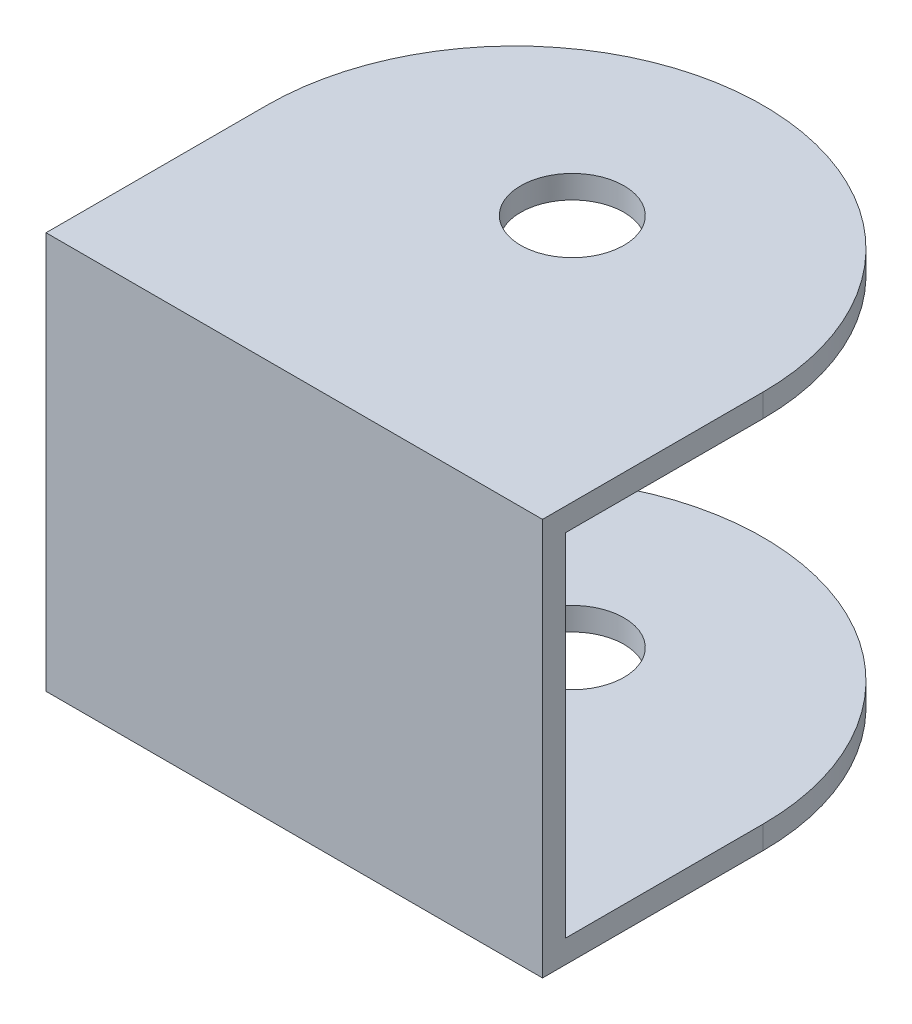
ISO-10303-21;
HEADER;
FILE_DESCRIPTION(('STEP AP214'),'2;1');
FILE_NAME('part.step','',(''),(''),'','','');
FILE_SCHEMA(('AUTOMOTIVE_DESIGN { 1 0 10303 214 1 1 1 1 }'));
ENDSEC;
DATA;
#1=APPLICATION_CONTEXT('core data for automotive mechanical design processes');
#2=APPLICATION_PROTOCOL_DEFINITION('international standard','automotive_design',2000,#1);
#3=PRODUCT_CONTEXT('',#1,'mechanical');
#4=PRODUCT('Part','Part','',(#3));
#5=PRODUCT_RELATED_PRODUCT_CATEGORY('part','',(#4));
#6=PRODUCT_DEFINITION_FORMATION('','',#4);
#7=PRODUCT_DEFINITION_CONTEXT('part definition',#1,'design');
#8=PRODUCT_DEFINITION('design','',#6,#7);
#9=PRODUCT_DEFINITION_SHAPE('','',#8);
#10=(LENGTH_UNIT() NAMED_UNIT(*) SI_UNIT(.MILLI.,.METRE.));
#11=(NAMED_UNIT(*) PLANE_ANGLE_UNIT() SI_UNIT($,.RADIAN.));
#12=(NAMED_UNIT(*) SI_UNIT($,.STERADIAN.) SOLID_ANGLE_UNIT());
#13=UNCERTAINTY_MEASURE_WITH_UNIT(LENGTH_MEASURE(1.E-05),#10,'distance_accuracy_value','');
#14=(GEOMETRIC_REPRESENTATION_CONTEXT(3) GLOBAL_UNCERTAINTY_ASSIGNED_CONTEXT((#13)) GLOBAL_UNIT_ASSIGNED_CONTEXT((#10,
#11,#12)) REPRESENTATION_CONTEXT('',''));
#15=CARTESIAN_POINT('',(0.,0.,0.));
#16=DIRECTION('',(0.,0.,1.));
#17=DIRECTION('',(1.,0.,0.));
#18=AXIS2_PLACEMENT_3D('',#15,#16,#17);
#19=CARTESIAN_POINT('',(0.,25.4,-14.1111111111111));
#20=DIRECTION('',(0.,-1.,0.));
#21=DIRECTION('',(0.,0.,-1.));
#22=AXIS2_PLACEMENT_3D('',#19,#20,#21);
#23=CYLINDRICAL_SURFACE('',#22,15.875);
#24=DIRECTION('',(0.,-1.,0.));
#25=VECTOR('',#24,1.);
#26=CARTESIAN_POINT('',(15.875,25.4,-14.1111111111111));
#27=LINE('',#26,#25);
#28=CARTESIAN_POINT('',(15.875,25.4,-14.1111111111111));
#29=VERTEX_POINT('',#28);
#30=CARTESIAN_POINT('',(15.875,23.9268,-14.1111111111111));
#31=VERTEX_POINT('',#30);
#32=EDGE_CURVE('E163',#29,#31,#27,.T.);
#33=ORIENTED_EDGE('',*,*,#32,.T.);
#34=CARTESIAN_POINT('',(0.,23.9268,-14.1111111111111));
#35=DIRECTION('',(0.,1.,0.));
#36=DIRECTION('',(0.,0.,1.));
#37=AXIS2_PLACEMENT_3D('',#34,#35,#36);
#38=CIRCLE('',#37,15.875);
#39=CARTESIAN_POINT('',(-15.875,23.9268,-14.1111111111111));
#40=VERTEX_POINT('',#39);
#41=EDGE_CURVE('E138',#31,#40,#38,.T.);
#42=ORIENTED_EDGE('',*,*,#41,.T.);
#43=DIRECTION('',(0.,-1.,0.));
#44=VECTOR('',#43,1.);
#45=CARTESIAN_POINT('',(-15.875,25.4,-14.1111111111111));
#46=LINE('',#45,#44);
#47=CARTESIAN_POINT('',(-15.875,25.4,-14.1111111111111));
#48=VERTEX_POINT('',#47);
#49=EDGE_CURVE('E160',#48,#40,#46,.T.);
#50=ORIENTED_EDGE('',*,*,#49,.F.);
#51=CARTESIAN_POINT('',(0.,25.4,-14.1111111111111));
#52=DIRECTION('',(0.,1.,0.));
#53=DIRECTION('',(0.,0.,-1.));
#54=AXIS2_PLACEMENT_3D('',#51,#52,#53);
#55=CIRCLE('',#54,15.875);
#56=EDGE_CURVE('E145',#29,#48,#55,.T.);
#57=ORIENTED_EDGE('',*,*,#56,.F.);
#58=EDGE_LOOP('',(#33,#42,#50,#57));
#59=FACE_BOUND('',#58,.T.);
#60=ADVANCED_FACE('F34',(#59),#23,.T.);
#61=CARTESIAN_POINT('',(0.,25.4,0.));
#62=DIRECTION('',(0.,0.,-1.));
#63=DIRECTION('',(-1.,0.,0.));
#64=AXIS2_PLACEMENT_3D('',#61,#62,#63);
#65=PLANE('',#64);
#66=DIRECTION('',(1.,0.,0.));
#67=VECTOR('',#66,1.);
#68=CARTESIAN_POINT('',(0.,0.,0.));
#69=LINE('',#68,#67);
#70=CARTESIAN_POINT('',(-15.875,0.,0.));
#71=VERTEX_POINT('',#70);
#72=CARTESIAN_POINT('',(15.875,0.,0.));
#73=VERTEX_POINT('',#72);
#74=EDGE_CURVE('E80',#71,#73,#69,.T.);
#75=ORIENTED_EDGE('',*,*,#74,.T.);
#76=DIRECTION('',(0.,-1.,0.));
#77=VECTOR('',#76,1.);
#78=CARTESIAN_POINT('',(15.875,25.4,0.));
#79=LINE('',#78,#77);
#80=CARTESIAN_POINT('',(15.875,25.4,0.));
#81=VERTEX_POINT('',#80);
#82=EDGE_CURVE('E43',#81,#73,#79,.T.);
#83=ORIENTED_EDGE('',*,*,#82,.F.);
#84=DIRECTION('',(1.,0.,0.));
#85=VECTOR('',#84,1.);
#86=CARTESIAN_POINT('',(-15.875,25.4,0.));
#87=LINE('',#86,#85);
#88=CARTESIAN_POINT('',(-15.875,25.4,0.));
#89=VERTEX_POINT('',#88);
#90=EDGE_CURVE('E85',#89,#81,#87,.T.);
#91=ORIENTED_EDGE('',*,*,#90,.F.);
#92=DIRECTION('',(0.,-1.,0.));
#93=VECTOR('',#92,1.);
#94=CARTESIAN_POINT('',(-15.875,25.4,0.));
#95=LINE('',#94,#93);
#96=EDGE_CURVE('E148',#89,#71,#95,.T.);
#97=ORIENTED_EDGE('',*,*,#96,.T.);
#98=EDGE_LOOP('',(#75,#83,#91,#97));
#99=FACE_BOUND('',#98,.T.);
#100=ADVANCED_FACE('F36',(#99),#65,.F.);
#101=CARTESIAN_POINT('',(15.875,25.4,-14.1111111111111));
#102=DIRECTION('',(-1.,0.,0.));
#103=DIRECTION('',(0.,0.,1.));
#104=AXIS2_PLACEMENT_3D('',#101,#102,#103);
#105=PLANE('',#104);
#106=DIRECTION('',(0.,-1.,0.));
#107=VECTOR('',#106,1.);
#108=CARTESIAN_POINT('',(15.875,1.4732,-1.4732));
#109=LINE('',#108,#107);
#110=CARTESIAN_POINT('',(15.875,23.9268,-1.4732));
#111=VERTEX_POINT('',#110);
#112=CARTESIAN_POINT('',(15.875,1.4732,-1.4732));
#113=VERTEX_POINT('',#112);
#114=EDGE_CURVE('E115',#111,#113,#109,.T.);
#115=ORIENTED_EDGE('',*,*,#114,.F.);
#116=DIRECTION('',(0.,0.,1.));
#117=VECTOR('',#116,1.);
#118=CARTESIAN_POINT('',(15.875,23.9268,-1.4732));
#119=LINE('',#118,#117);
#120=EDGE_CURVE('E126',#31,#111,#119,.T.);
#121=ORIENTED_EDGE('',*,*,#120,.F.);
#122=ORIENTED_EDGE('',*,*,#32,.F.);
#123=DIRECTION('',(0.,0.,-1.));
#124=VECTOR('',#123,1.);
#125=CARTESIAN_POINT('',(15.875,25.4,-14.1111111111111));
#126=LINE('',#125,#124);
#127=EDGE_CURVE('E142',#81,#29,#126,.T.);
#128=ORIENTED_EDGE('',*,*,#127,.F.);
#129=ORIENTED_EDGE('',*,*,#82,.T.);
#130=DIRECTION('',(0.,0.,-1.));
#131=VECTOR('',#130,1.);
#132=CARTESIAN_POINT('',(15.875,0.,-14.1111111111111));
#133=LINE('',#132,#131);
#134=CARTESIAN_POINT('',(15.875,0.,-14.1111111111111));
#135=VERTEX_POINT('',#134);
#136=EDGE_CURVE('E150',#73,#135,#133,.T.);
#137=ORIENTED_EDGE('',*,*,#136,.T.);
#138=CARTESIAN_POINT('',(15.875,1.4732,-14.1111111111111));
#139=VERTEX_POINT('',#138);
#140=EDGE_CURVE('E162',#139,#135,#27,.T.);
#141=ORIENTED_EDGE('',*,*,#140,.F.);
#142=DIRECTION('',(0.,0.,-1.));
#143=VECTOR('',#142,1.);
#144=CARTESIAN_POINT('',(15.875,1.4732,-1.4732));
#145=LINE('',#144,#143);
#146=EDGE_CURVE('E128',#113,#139,#145,.T.);
#147=ORIENTED_EDGE('',*,*,#146,.F.);
#148=EDGE_LOOP('',(#115,#121,#122,#128,#129,#137,#141,#147));
#149=FACE_BOUND('',#148,.T.);
#150=ADVANCED_FACE('F169',(#149),#105,.F.);
#151=CARTESIAN_POINT('',(-15.875,1.4732,-14.1111111111111));
#152=VERTEX_POINT('',#151);
#153=CARTESIAN_POINT('',(-15.875,0.,-14.1111111111111));
#154=VERTEX_POINT('',#153);
#155=EDGE_CURVE('E159',#152,#154,#46,.T.);
#156=ORIENTED_EDGE('',*,*,#155,.F.);
#157=CARTESIAN_POINT('',(0.,1.4732,-14.1111111111111));
#158=DIRECTION('',(0.,-1.,0.));
#159=DIRECTION('',(0.,0.,-1.));
#160=AXIS2_PLACEMENT_3D('',#157,#158,#159);
#161=CIRCLE('',#160,15.875);
#162=EDGE_CURVE('E50',#152,#139,#161,.T.);
#163=ORIENTED_EDGE('',*,*,#162,.T.);
#164=ORIENTED_EDGE('',*,*,#140,.T.);
#165=CARTESIAN_POINT('',(0.,0.,-14.1111111111111));
#166=DIRECTION('',(0.,1.,0.));
#167=DIRECTION('',(0.,0.,-1.));
#168=AXIS2_PLACEMENT_3D('',#165,#166,#167);
#169=CIRCLE('',#168,15.875);
#170=EDGE_CURVE('E153',#135,#154,#169,.T.);
#171=ORIENTED_EDGE('',*,*,#170,.T.);
#172=EDGE_LOOP('',(#156,#163,#164,#171));
#173=FACE_BOUND('',#172,.T.);
#174=ADVANCED_FACE('F176',(#173),#23,.T.);
#175=CARTESIAN_POINT('',(-15.875,25.4,-14.1111111111111));
#176=DIRECTION('',(1.,0.,0.));
#177=DIRECTION('',(0.,0.,-1.));
#178=AXIS2_PLACEMENT_3D('',#175,#176,#177);
#179=PLANE('',#178);
#180=ORIENTED_EDGE('',*,*,#49,.T.);
#181=DIRECTION('',(0.,0.,1.));
#182=VECTOR('',#181,1.);
#183=CARTESIAN_POINT('',(-15.875,23.9268,-14.1111111111111));
#184=LINE('',#183,#182);
#185=CARTESIAN_POINT('',(-15.875,23.9268,-1.4732));
#186=VERTEX_POINT('',#185);
#187=EDGE_CURVE('E11',#40,#186,#184,.T.);
#188=ORIENTED_EDGE('',*,*,#187,.T.);
#189=DIRECTION('',(0.,-1.,0.));
#190=VECTOR('',#189,1.);
#191=CARTESIAN_POINT('',(-15.875,1.4732,-1.4732));
#192=LINE('',#191,#190);
#193=CARTESIAN_POINT('',(-15.875,1.4732,-1.4732));
#194=VERTEX_POINT('',#193);
#195=EDGE_CURVE('E113',#186,#194,#192,.T.);
#196=ORIENTED_EDGE('',*,*,#195,.T.);
#197=DIRECTION('',(0.,0.,-1.));
#198=VECTOR('',#197,1.);
#199=CARTESIAN_POINT('',(-15.875,1.4732,-1.4732));
#200=LINE('',#199,#198);
#201=EDGE_CURVE('E118',#194,#152,#200,.T.);
#202=ORIENTED_EDGE('',*,*,#201,.T.);
#203=ORIENTED_EDGE('',*,*,#155,.T.);
#204=DIRECTION('',(0.,0.,1.));
#205=VECTOR('',#204,1.);
#206=CARTESIAN_POINT('',(-15.875,0.,-14.1111111111111));
#207=LINE('',#206,#205);
#208=EDGE_CURVE('E143',#154,#71,#207,.T.);
#209=ORIENTED_EDGE('',*,*,#208,.T.);
#210=ORIENTED_EDGE('',*,*,#96,.F.);
#211=DIRECTION('',(0.,0.,1.));
#212=VECTOR('',#211,1.);
#213=CARTESIAN_POINT('',(-15.875,25.4,-14.1111111111111));
#214=LINE('',#213,#212);
#215=EDGE_CURVE('E59',#48,#89,#214,.T.);
#216=ORIENTED_EDGE('',*,*,#215,.F.);
#217=EDGE_LOOP('',(#180,#188,#196,#202,#203,#209,#210,#216));
#218=FACE_BOUND('',#217,.T.);
#219=ADVANCED_FACE('F125',(#218),#179,.F.);
#220=CARTESIAN_POINT('',(0.,25.4,-14.1111111111111));
#221=DIRECTION('',(0.,-1.,0.));
#222=DIRECTION('',(0.,0.,-1.));
#223=AXIS2_PLACEMENT_3D('',#220,#221,#222);
#224=PLANE('',#223);
#225=CARTESIAN_POINT('',(0.,25.4,-17.78));
#226=DIRECTION('',(0.,-1.,0.));
#227=DIRECTION('',(0.,0.,-1.));
#228=AXIS2_PLACEMENT_3D('',#225,#226,#227);
#229=CIRCLE('',#228,3.302);
#230=CARTESIAN_POINT('',(0.,25.4,-21.082));
#231=VERTEX_POINT('',#230);
#232=EDGE_CURVE('E270',#231,#231,#229,.T.);
#233=ORIENTED_EDGE('',*,*,#232,.T.);
#234=EDGE_LOOP('',(#233));
#235=FACE_BOUND('',#234,.T.);
#236=ORIENTED_EDGE('',*,*,#90,.T.);
#237=ORIENTED_EDGE('',*,*,#127,.T.);
#238=ORIENTED_EDGE('',*,*,#56,.T.);
#239=ORIENTED_EDGE('',*,*,#215,.T.);
#240=EDGE_LOOP('',(#236,#237,#238,#239));
#241=FACE_BOUND('',#240,.T.);
#242=ADVANCED_FACE('F182',(#235,#241),#224,.F.);
#243=CARTESIAN_POINT('',(0.,0.,-14.1111111111111));
#244=DIRECTION('',(0.,-1.,0.));
#245=DIRECTION('',(0.,0.,-1.));
#246=AXIS2_PLACEMENT_3D('',#243,#244,#245);
#247=PLANE('',#246);
#248=CARTESIAN_POINT('',(0.,0.,-17.78));
#249=DIRECTION('',(0.,-1.,0.));
#250=DIRECTION('',(0.,0.,-1.));
#251=AXIS2_PLACEMENT_3D('',#248,#249,#250);
#252=CIRCLE('',#251,3.302);
#253=CARTESIAN_POINT('',(0.,0.,-21.082));
#254=VERTEX_POINT('',#253);
#255=EDGE_CURVE('E275',#254,#254,#252,.T.);
#256=ORIENTED_EDGE('',*,*,#255,.F.);
#257=EDGE_LOOP('',(#256));
#258=FACE_BOUND('',#257,.T.);
#259=ORIENTED_EDGE('',*,*,#74,.F.);
#260=ORIENTED_EDGE('',*,*,#208,.F.);
#261=ORIENTED_EDGE('',*,*,#170,.F.);
#262=ORIENTED_EDGE('',*,*,#136,.F.);
#263=EDGE_LOOP('',(#259,#260,#261,#262));
#264=FACE_BOUND('',#263,.T.);
#265=ADVANCED_FACE('F174',(#258,#264),#247,.T.);
#266=CARTESIAN_POINT('',(-15.875,23.9268,-1.4732));
#267=DIRECTION('',(0.,1.,0.));
#268=DIRECTION('',(0.,0.,1.));
#269=AXIS2_PLACEMENT_3D('',#266,#267,#268);
#270=PLANE('',#269);
#271=CARTESIAN_POINT('',(0.,23.9268,-17.78));
#272=DIRECTION('',(0.,1.,0.));
#273=DIRECTION('',(0.,0.,1.));
#274=AXIS2_PLACEMENT_3D('',#271,#272,#273);
#275=CIRCLE('',#274,3.302);
#276=CARTESIAN_POINT('',(0.,23.9268,-14.478));
#277=VERTEX_POINT('',#276);
#278=EDGE_CURVE('E131',#277,#277,#275,.T.);
#279=ORIENTED_EDGE('',*,*,#278,.T.);
#280=EDGE_LOOP('',(#279));
#281=FACE_BOUND('',#280,.T.);
#282=ORIENTED_EDGE('',*,*,#120,.T.);
#283=DIRECTION('',(1.,0.,0.));
#284=VECTOR('',#283,1.);
#285=CARTESIAN_POINT('',(-15.875,23.9268,-1.4732));
#286=LINE('',#285,#284);
#287=EDGE_CURVE('E117',#186,#111,#286,.T.);
#288=ORIENTED_EDGE('',*,*,#287,.F.);
#289=ORIENTED_EDGE('',*,*,#187,.F.);
#290=ORIENTED_EDGE('',*,*,#41,.F.);
#291=EDGE_LOOP('',(#282,#288,#289,#290));
#292=FACE_BOUND('',#291,.T.);
#293=ADVANCED_FACE('F190',(#281,#292),#270,.F.);
#294=CARTESIAN_POINT('',(-15.875,1.4732,-1.4732));
#295=DIRECTION('',(0.,-1.,0.));
#296=DIRECTION('',(0.,0.,-1.));
#297=AXIS2_PLACEMENT_3D('',#294,#295,#296);
#298=PLANE('',#297);
#299=CARTESIAN_POINT('',(0.,1.4732,-17.78));
#300=DIRECTION('',(0.,-1.,0.));
#301=DIRECTION('',(0.,0.,-1.));
#302=AXIS2_PLACEMENT_3D('',#299,#300,#301);
#303=CIRCLE('',#302,3.302);
#304=CARTESIAN_POINT('',(0.,1.4732,-21.082));
#305=VERTEX_POINT('',#304);
#306=EDGE_CURVE('E38',#305,#305,#303,.T.);
#307=ORIENTED_EDGE('',*,*,#306,.T.);
#308=EDGE_LOOP('',(#307));
#309=FACE_BOUND('',#308,.T.);
#310=ORIENTED_EDGE('',*,*,#201,.F.);
#311=DIRECTION('',(1.,0.,0.));
#312=VECTOR('',#311,1.);
#313=CARTESIAN_POINT('',(-15.875,1.4732,-1.4732));
#314=LINE('',#313,#312);
#315=EDGE_CURVE('E109',#194,#113,#314,.T.);
#316=ORIENTED_EDGE('',*,*,#315,.T.);
#317=ORIENTED_EDGE('',*,*,#146,.T.);
#318=ORIENTED_EDGE('',*,*,#162,.F.);
#319=EDGE_LOOP('',(#310,#316,#317,#318));
#320=FACE_BOUND('',#319,.T.);
#321=ADVANCED_FACE('F120',(#309,#320),#298,.F.);
#322=CARTESIAN_POINT('',(-15.875,1.4732,-1.4732));
#323=DIRECTION('',(0.,0.,1.));
#324=DIRECTION('',(1.,0.,0.));
#325=AXIS2_PLACEMENT_3D('',#322,#323,#324);
#326=PLANE('',#325);
#327=ORIENTED_EDGE('',*,*,#114,.T.);
#328=ORIENTED_EDGE('',*,*,#315,.F.);
#329=ORIENTED_EDGE('',*,*,#195,.F.);
#330=ORIENTED_EDGE('',*,*,#287,.T.);
#331=EDGE_LOOP('',(#327,#328,#329,#330));
#332=FACE_BOUND('',#331,.T.);
#333=ADVANCED_FACE('F110',(#332),#326,.F.);
#334=CARTESIAN_POINT('',(0.,25.4,-17.78));
#335=DIRECTION('',(0.,-1.,0.));
#336=DIRECTION('',(0.,0.,-1.));
#337=AXIS2_PLACEMENT_3D('',#334,#335,#336);
#338=CYLINDRICAL_SURFACE('',#337,3.302);
#339=ORIENTED_EDGE('',*,*,#255,.T.);
#340=EDGE_LOOP('',(#339));
#341=FACE_BOUND('',#340,.T.);
#342=ORIENTED_EDGE('',*,*,#306,.F.);
#343=EDGE_LOOP('',(#342));
#344=FACE_BOUND('',#343,.T.);
#345=ADVANCED_FACE('F247',(#341,#344),#338,.F.);
#346=ORIENTED_EDGE('',*,*,#232,.F.);
#347=EDGE_LOOP('',(#346));
#348=FACE_BOUND('',#347,.T.);
#349=ORIENTED_EDGE('',*,*,#278,.F.);
#350=EDGE_LOOP('',(#349));
#351=FACE_BOUND('',#350,.T.);
#352=ADVANCED_FACE('F255',(#348,#351),#338,.F.);
#353=CLOSED_SHELL('',(#60,#100,#150,#174,#219,#242,#265,#293,#321,#333,#345,#352));
#354=MANIFOLD_SOLID_BREP('B2',#353);
#355=ADVANCED_BREP_SHAPE_REPRESENTATION('',(#18,#354),#14);
#356=SHAPE_DEFINITION_REPRESENTATION(#9,#355);
ENDSEC;
END-ISO-10303-21;
